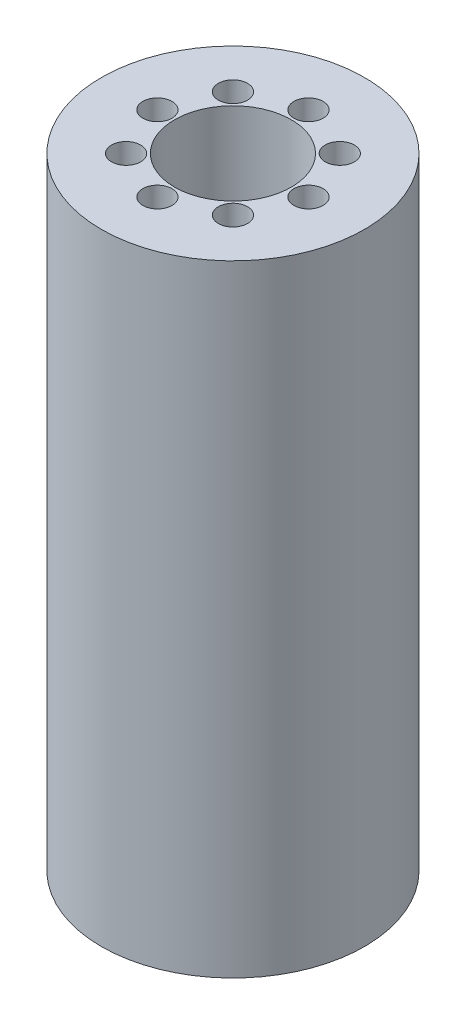
ISO-10303-21;
HEADER;
FILE_DESCRIPTION(('STEP AP214'),'2;1');
FILE_NAME('part.step','',(''),(''),'','','');
FILE_SCHEMA(('AUTOMOTIVE_DESIGN { 1 0 10303 214 1 1 1 1 }'));
ENDSEC;
DATA;
#1=APPLICATION_CONTEXT('core data for automotive mechanical design processes');
#2=APPLICATION_PROTOCOL_DEFINITION('international standard','automotive_design',2000,#1);
#3=PRODUCT_CONTEXT('',#1,'mechanical');
#4=PRODUCT('Part','Part','',(#3));
#5=PRODUCT_RELATED_PRODUCT_CATEGORY('part','',(#4));
#6=PRODUCT_DEFINITION_FORMATION('','',#4);
#7=PRODUCT_DEFINITION_CONTEXT('part definition',#1,'design');
#8=PRODUCT_DEFINITION('design','',#6,#7);
#9=PRODUCT_DEFINITION_SHAPE('','',#8);
#10=(LENGTH_UNIT() NAMED_UNIT(*) SI_UNIT(.MILLI.,.METRE.));
#11=(NAMED_UNIT(*) PLANE_ANGLE_UNIT() SI_UNIT($,.RADIAN.));
#12=(NAMED_UNIT(*) SI_UNIT($,.STERADIAN.) SOLID_ANGLE_UNIT());
#13=UNCERTAINTY_MEASURE_WITH_UNIT(LENGTH_MEASURE(1.E-05),#10,'distance_accuracy_value','');
#14=(GEOMETRIC_REPRESENTATION_CONTEXT(3) GLOBAL_UNCERTAINTY_ASSIGNED_CONTEXT((#13)) GLOBAL_UNIT_ASSIGNED_CONTEXT((#10,
#11,#12)) REPRESENTATION_CONTEXT('',''));
#15=CARTESIAN_POINT('',(0.,0.,0.));
#16=DIRECTION('',(0.,0.,1.));
#17=DIRECTION('',(1.,0.,0.));
#18=AXIS2_PLACEMENT_3D('',#15,#16,#17);
#19=CARTESIAN_POINT('',(0.,319.,0.));
#20=DIRECTION('',(0.,1.,0.));
#21=DIRECTION('',(0.,0.,1.));
#22=AXIS2_PLACEMENT_3D('',#19,#20,#21);
#23=PLANE('',#22);
#24=CARTESIAN_POINT('',(-27.4357431100384,319.,27.4357431100377));
#25=DIRECTION('',(0.,1.,0.));
#26=DIRECTION('',(0.,0.,1.));
#27=AXIS2_PLACEMENT_3D('',#24,#25,#26);
#28=CIRCLE('',#27,7.5);
#29=CARTESIAN_POINT('',(-27.4357431100384,319.,34.9357431100377));
#30=VERTEX_POINT('',#29);
#31=EDGE_CURVE('E65',#30,#30,#28,.T.);
#32=ORIENTED_EDGE('',*,*,#31,.F.);
#33=EDGE_LOOP('',(#32));
#34=FACE_BOUND('',#33,.T.);
#35=CARTESIAN_POINT('',(-4.00721122950642E-13,319.,38.8));
#36=DIRECTION('',(0.,1.,0.));
#37=DIRECTION('',(0.,0.,1.));
#38=AXIS2_PLACEMENT_3D('',#35,#36,#37);
#39=CIRCLE('',#38,7.5);
#40=CARTESIAN_POINT('',(-4.00721122950642E-13,319.,46.3));
#41=VERTEX_POINT('',#40);
#42=EDGE_CURVE('E64',#41,#41,#39,.T.);
#43=ORIENTED_EDGE('',*,*,#42,.F.);
#44=EDGE_LOOP('',(#43));
#45=FACE_BOUND('',#44,.T.);
#46=CARTESIAN_POINT('',(27.4357431100378,319.,27.4357431100383));
#47=DIRECTION('',(0.,1.,0.));
#48=DIRECTION('',(0.,0.,1.));
#49=AXIS2_PLACEMENT_3D('',#46,#47,#48);
#50=CIRCLE('',#49,7.5);
#51=CARTESIAN_POINT('',(27.4357431100378,319.,34.9357431100383));
#52=VERTEX_POINT('',#51);
#53=EDGE_CURVE('E71',#52,#52,#50,.T.);
#54=ORIENTED_EDGE('',*,*,#53,.F.);
#55=EDGE_LOOP('',(#54));
#56=FACE_BOUND('',#55,.T.);
#57=CARTESIAN_POINT('',(38.8,319.,2.63677968348475E-13));
#58=DIRECTION('',(0.,1.,0.));
#59=DIRECTION('',(0.,0.,1.));
#60=AXIS2_PLACEMENT_3D('',#57,#58,#59);
#61=CIRCLE('',#60,7.5);
#62=CARTESIAN_POINT('',(38.8,319.,7.50000000000026));
#63=VERTEX_POINT('',#62);
#64=EDGE_CURVE('E83',#63,#63,#61,.T.);
#65=ORIENTED_EDGE('',*,*,#64,.F.);
#66=EDGE_LOOP('',(#65));
#67=FACE_BOUND('',#66,.T.);
#68=CARTESIAN_POINT('',(-27.4357431100376,319.,-27.4357431100385));
#69=DIRECTION('',(0.,1.,0.));
#70=DIRECTION('',(0.,0.,1.));
#71=AXIS2_PLACEMENT_3D('',#68,#69,#70);
#72=CIRCLE('',#71,7.5);
#73=CARTESIAN_POINT('',(-27.4357431100376,319.,-19.9357431100385));
#74=VERTEX_POINT('',#73);
#75=EDGE_CURVE('E84',#74,#74,#72,.T.);
#76=ORIENTED_EDGE('',*,*,#75,.F.);
#77=EDGE_LOOP('',(#76));
#78=FACE_BOUND('',#77,.T.);
#79=CARTESIAN_POINT('',(1.38777878078145E-13,319.,-38.8));
#80=DIRECTION('',(0.,1.,0.));
#81=DIRECTION('',(0.,0.,1.));
#82=AXIS2_PLACEMENT_3D('',#79,#80,#81);
#83=CIRCLE('',#82,7.5);
#84=CARTESIAN_POINT('',(1.38777878078145E-13,319.,-31.3));
#85=VERTEX_POINT('',#84);
#86=EDGE_CURVE('E95',#85,#85,#83,.T.);
#87=ORIENTED_EDGE('',*,*,#86,.F.);
#88=EDGE_LOOP('',(#87));
#89=FACE_BOUND('',#88,.T.);
#90=CARTESIAN_POINT('',(27.4357431100382,319.,-27.4357431100379));
#91=DIRECTION('',(0.,1.,0.));
#92=DIRECTION('',(0.,0.,1.));
#93=AXIS2_PLACEMENT_3D('',#90,#91,#92);
#94=CIRCLE('',#93,7.5);
#95=CARTESIAN_POINT('',(27.4357431100382,319.,-19.9357431100379));
#96=VERTEX_POINT('',#95);
#97=EDGE_CURVE('E77',#96,#96,#94,.T.);
#98=ORIENTED_EDGE('',*,*,#97,.F.);
#99=EDGE_LOOP('',(#98));
#100=FACE_BOUND('',#99,.T.);
#101=CARTESIAN_POINT('',(-38.8,319.,0.));
#102=DIRECTION('',(0.,1.,0.));
#103=DIRECTION('',(0.,0.,1.));
#104=AXIS2_PLACEMENT_3D('',#101,#102,#103);
#105=CIRCLE('',#104,7.5);
#106=CARTESIAN_POINT('',(-38.8,319.,7.5));
#107=VERTEX_POINT('',#106);
#108=EDGE_CURVE('E57',#107,#107,#105,.T.);
#109=ORIENTED_EDGE('',*,*,#108,.F.);
#110=EDGE_LOOP('',(#109));
#111=FACE_BOUND('',#110,.T.);
#112=CARTESIAN_POINT('',(0.,319.,0.));
#113=DIRECTION('',(0.,1.,0.));
#114=DIRECTION('',(0.,0.,1.));
#115=AXIS2_PLACEMENT_3D('',#112,#113,#114);
#116=CIRCLE('',#115,67.58);
#117=CARTESIAN_POINT('',(0.,319.,67.58));
#118=VERTEX_POINT('',#117);
#119=EDGE_CURVE('E10',#118,#118,#116,.T.);
#120=ORIENTED_EDGE('',*,*,#119,.T.);
#121=EDGE_LOOP('',(#120));
#122=FACE_BOUND('',#121,.T.);
#123=CARTESIAN_POINT('',(0.,319.,0.));
#124=DIRECTION('',(0.,1.,0.));
#125=DIRECTION('',(0.,0.,1.));
#126=AXIS2_PLACEMENT_3D('',#123,#124,#125);
#127=CIRCLE('',#126,30.);
#128=CARTESIAN_POINT('',(0.,319.,30.));
#129=VERTEX_POINT('',#128);
#130=EDGE_CURVE('E47',#129,#129,#127,.T.);
#131=ORIENTED_EDGE('',*,*,#130,.F.);
#132=EDGE_LOOP('',(#131));
#133=FACE_BOUND('',#132,.T.);
#134=ADVANCED_FACE('F36',(#34,#45,#56,#67,#78,#89,#100,#111,#122,#133),#23,.T.);
#135=CARTESIAN_POINT('',(0.,0.,0.));
#136=DIRECTION('',(0.,1.,0.));
#137=DIRECTION('',(0.,0.,1.));
#138=AXIS2_PLACEMENT_3D('',#135,#136,#137);
#139=PLANE('',#138);
#140=CARTESIAN_POINT('',(-27.4357431100384,0.,27.4357431100377));
#141=DIRECTION('',(0.,1.,0.));
#142=DIRECTION('',(0.,0.,1.));
#143=AXIS2_PLACEMENT_3D('',#140,#141,#142);
#144=CIRCLE('',#143,7.5);
#145=CARTESIAN_POINT('',(-27.4357431100384,0.,34.9357431100377));
#146=VERTEX_POINT('',#145);
#147=EDGE_CURVE('E61',#146,#146,#144,.F.);
#148=ORIENTED_EDGE('',*,*,#147,.F.);
#149=EDGE_LOOP('',(#148));
#150=FACE_BOUND('',#149,.T.);
#151=CARTESIAN_POINT('',(-4.00721122950642E-13,0.,38.8));
#152=DIRECTION('',(0.,1.,0.));
#153=DIRECTION('',(0.,0.,1.));
#154=AXIS2_PLACEMENT_3D('',#151,#152,#153);
#155=CIRCLE('',#154,7.5);
#156=CARTESIAN_POINT('',(-4.00721122950642E-13,0.,46.3));
#157=VERTEX_POINT('',#156);
#158=EDGE_CURVE('E68',#157,#157,#155,.F.);
#159=ORIENTED_EDGE('',*,*,#158,.F.);
#160=EDGE_LOOP('',(#159));
#161=FACE_BOUND('',#160,.T.);
#162=CARTESIAN_POINT('',(27.4357431100378,0.,27.4357431100383));
#163=DIRECTION('',(0.,1.,0.));
#164=DIRECTION('',(0.,0.,1.));
#165=AXIS2_PLACEMENT_3D('',#162,#163,#164);
#166=CIRCLE('',#165,7.5);
#167=CARTESIAN_POINT('',(27.4357431100378,0.,34.9357431100383));
#168=VERTEX_POINT('',#167);
#169=EDGE_CURVE('E74',#168,#168,#166,.F.);
#170=ORIENTED_EDGE('',*,*,#169,.F.);
#171=EDGE_LOOP('',(#170));
#172=FACE_BOUND('',#171,.T.);
#173=CARTESIAN_POINT('',(38.8,0.,2.63677968348475E-13));
#174=DIRECTION('',(0.,1.,0.));
#175=DIRECTION('',(0.,0.,1.));
#176=AXIS2_PLACEMENT_3D('',#173,#174,#175);
#177=CIRCLE('',#176,7.5);
#178=CARTESIAN_POINT('',(38.8,0.,7.50000000000026));
#179=VERTEX_POINT('',#178);
#180=EDGE_CURVE('E60',#179,#179,#177,.F.);
#181=ORIENTED_EDGE('',*,*,#180,.F.);
#182=EDGE_LOOP('',(#181));
#183=FACE_BOUND('',#182,.T.);
#184=CARTESIAN_POINT('',(-27.4357431100376,0.,-27.4357431100385));
#185=DIRECTION('',(0.,1.,0.));
#186=DIRECTION('',(0.,0.,1.));
#187=AXIS2_PLACEMENT_3D('',#184,#185,#186);
#188=CIRCLE('',#187,7.5);
#189=CARTESIAN_POINT('',(-27.4357431100376,0.,-19.9357431100385));
#190=VERTEX_POINT('',#189);
#191=EDGE_CURVE('E80',#190,#190,#188,.F.);
#192=ORIENTED_EDGE('',*,*,#191,.F.);
#193=EDGE_LOOP('',(#192));
#194=FACE_BOUND('',#193,.T.);
#195=CARTESIAN_POINT('',(1.38777878078145E-13,0.,-38.8));
#196=DIRECTION('',(0.,1.,0.));
#197=DIRECTION('',(0.,0.,1.));
#198=AXIS2_PLACEMENT_3D('',#195,#196,#197);
#199=CIRCLE('',#198,7.5);
#200=CARTESIAN_POINT('',(1.38777878078145E-13,0.,-31.3));
#201=VERTEX_POINT('',#200);
#202=EDGE_CURVE('E87',#201,#201,#199,.F.);
#203=ORIENTED_EDGE('',*,*,#202,.F.);
#204=EDGE_LOOP('',(#203));
#205=FACE_BOUND('',#204,.T.);
#206=CARTESIAN_POINT('',(27.4357431100382,0.,-27.4357431100379));
#207=DIRECTION('',(0.,1.,0.));
#208=DIRECTION('',(0.,0.,1.));
#209=AXIS2_PLACEMENT_3D('',#206,#207,#208);
#210=CIRCLE('',#209,7.5);
#211=CARTESIAN_POINT('',(27.4357431100382,0.,-19.9357431100379));
#212=VERTEX_POINT('',#211);
#213=EDGE_CURVE('E92',#212,#212,#210,.F.);
#214=ORIENTED_EDGE('',*,*,#213,.F.);
#215=EDGE_LOOP('',(#214));
#216=FACE_BOUND('',#215,.T.);
#217=CARTESIAN_POINT('',(-38.8,0.,0.));
#218=DIRECTION('',(0.,1.,0.));
#219=DIRECTION('',(0.,0.,1.));
#220=AXIS2_PLACEMENT_3D('',#217,#218,#219);
#221=CIRCLE('',#220,7.5);
#222=CARTESIAN_POINT('',(-38.8,0.,7.5));
#223=VERTEX_POINT('',#222);
#224=EDGE_CURVE('E52',#223,#223,#221,.F.);
#225=ORIENTED_EDGE('',*,*,#224,.F.);
#226=EDGE_LOOP('',(#225));
#227=FACE_BOUND('',#226,.T.);
#228=CARTESIAN_POINT('',(0.,0.,0.));
#229=DIRECTION('',(0.,1.,0.));
#230=DIRECTION('',(0.,0.,1.));
#231=AXIS2_PLACEMENT_3D('',#228,#229,#230);
#232=CIRCLE('',#231,67.58);
#233=CARTESIAN_POINT('',(0.,0.,67.58));
#234=VERTEX_POINT('',#233);
#235=EDGE_CURVE('E40',#234,#234,#232,.T.);
#236=ORIENTED_EDGE('',*,*,#235,.F.);
#237=EDGE_LOOP('',(#236));
#238=FACE_BOUND('',#237,.T.);
#239=CARTESIAN_POINT('',(0.,0.,0.));
#240=DIRECTION('',(0.,1.,0.));
#241=DIRECTION('',(0.,0.,1.));
#242=AXIS2_PLACEMENT_3D('',#239,#240,#241);
#243=CIRCLE('',#242,30.);
#244=CARTESIAN_POINT('',(0.,0.,30.));
#245=VERTEX_POINT('',#244);
#246=EDGE_CURVE('E49',#245,#245,#243,.T.);
#247=ORIENTED_EDGE('',*,*,#246,.T.);
#248=EDGE_LOOP('',(#247));
#249=FACE_BOUND('',#248,.T.);
#250=ADVANCED_FACE('F108',(#150,#161,#172,#183,#194,#205,#216,#227,#238,#249),#139,.F.);
#251=CARTESIAN_POINT('',(0.,319.,0.));
#252=DIRECTION('',(0.,-1.,0.));
#253=DIRECTION('',(0.,0.,-1.));
#254=AXIS2_PLACEMENT_3D('',#251,#252,#253);
#255=CYLINDRICAL_SURFACE('',#254,67.58);
#256=ORIENTED_EDGE('',*,*,#119,.F.);
#257=EDGE_LOOP('',(#256));
#258=FACE_BOUND('',#257,.T.);
#259=ORIENTED_EDGE('',*,*,#235,.T.);
#260=EDGE_LOOP('',(#259));
#261=FACE_BOUND('',#260,.T.);
#262=ADVANCED_FACE('F38',(#258,#261),#255,.T.);
#263=CARTESIAN_POINT('',(0.,319.,0.));
#264=DIRECTION('',(0.,-1.,0.));
#265=DIRECTION('',(0.,0.,-1.));
#266=AXIS2_PLACEMENT_3D('',#263,#264,#265);
#267=CYLINDRICAL_SURFACE('',#266,30.);
#268=ORIENTED_EDGE('',*,*,#130,.T.);
#269=EDGE_LOOP('',(#268));
#270=FACE_BOUND('',#269,.T.);
#271=ORIENTED_EDGE('',*,*,#246,.F.);
#272=EDGE_LOOP('',(#271));
#273=FACE_BOUND('',#272,.T.);
#274=ADVANCED_FACE('F117',(#270,#273),#267,.F.);
#275=CARTESIAN_POINT('',(-38.8,-0.000999999999973245,0.));
#276=DIRECTION('',(0.,1.,0.));
#277=DIRECTION('',(0.,0.,1.));
#278=AXIS2_PLACEMENT_3D('',#275,#276,#277);
#279=CYLINDRICAL_SURFACE('',#278,7.5);
#280=ORIENTED_EDGE('',*,*,#108,.T.);
#281=EDGE_LOOP('',(#280));
#282=FACE_BOUND('',#281,.T.);
#283=ORIENTED_EDGE('',*,*,#224,.T.);
#284=EDGE_LOOP('',(#283));
#285=FACE_BOUND('',#284,.T.);
#286=ADVANCED_FACE('F120',(#282,#285),#279,.F.);
#287=CARTESIAN_POINT('',(27.4357431100382,-0.000999999999973245,-27.4357431100379));
#288=DIRECTION('',(0.,1.,0.));
#289=DIRECTION('',(0.,0.,1.));
#290=AXIS2_PLACEMENT_3D('',#287,#288,#289);
#291=CYLINDRICAL_SURFACE('',#290,7.5);
#292=ORIENTED_EDGE('',*,*,#97,.T.);
#293=EDGE_LOOP('',(#292));
#294=FACE_BOUND('',#293,.T.);
#295=ORIENTED_EDGE('',*,*,#213,.T.);
#296=EDGE_LOOP('',(#295));
#297=FACE_BOUND('',#296,.T.);
#298=ADVANCED_FACE('F135',(#294,#297),#291,.F.);
#299=CARTESIAN_POINT('',(1.38777878078145E-13,-0.000999999999973245,-38.8));
#300=DIRECTION('',(0.,1.,0.));
#301=DIRECTION('',(0.,0.,1.));
#302=AXIS2_PLACEMENT_3D('',#299,#300,#301);
#303=CYLINDRICAL_SURFACE('',#302,7.5);
#304=ORIENTED_EDGE('',*,*,#86,.T.);
#305=EDGE_LOOP('',(#304));
#306=FACE_BOUND('',#305,.T.);
#307=ORIENTED_EDGE('',*,*,#202,.T.);
#308=EDGE_LOOP('',(#307));
#309=FACE_BOUND('',#308,.T.);
#310=ADVANCED_FACE('F103',(#306,#309),#303,.F.);
#311=CARTESIAN_POINT('',(-27.4357431100376,-0.000999999999973245,-27.4357431100385));
#312=DIRECTION('',(0.,1.,0.));
#313=DIRECTION('',(0.,0.,1.));
#314=AXIS2_PLACEMENT_3D('',#311,#312,#313);
#315=CYLINDRICAL_SURFACE('',#314,7.5);
#316=ORIENTED_EDGE('',*,*,#75,.T.);
#317=EDGE_LOOP('',(#316));
#318=FACE_BOUND('',#317,.T.);
#319=ORIENTED_EDGE('',*,*,#191,.T.);
#320=EDGE_LOOP('',(#319));
#321=FACE_BOUND('',#320,.T.);
#322=ADVANCED_FACE('F150',(#318,#321),#315,.F.);
#323=CARTESIAN_POINT('',(38.8,-0.000999999999973245,2.63677968348475E-13));
#324=DIRECTION('',(0.,1.,0.));
#325=DIRECTION('',(0.,0.,1.));
#326=AXIS2_PLACEMENT_3D('',#323,#324,#325);
#327=CYLINDRICAL_SURFACE('',#326,7.5);
#328=ORIENTED_EDGE('',*,*,#64,.T.);
#329=EDGE_LOOP('',(#328));
#330=FACE_BOUND('',#329,.T.);
#331=ORIENTED_EDGE('',*,*,#180,.T.);
#332=EDGE_LOOP('',(#331));
#333=FACE_BOUND('',#332,.T.);
#334=ADVANCED_FACE('F148',(#330,#333),#327,.F.);
#335=CARTESIAN_POINT('',(27.4357431100378,-0.000999999999973245,27.4357431100383));
#336=DIRECTION('',(0.,1.,0.));
#337=DIRECTION('',(0.,0.,1.));
#338=AXIS2_PLACEMENT_3D('',#335,#336,#337);
#339=CYLINDRICAL_SURFACE('',#338,7.5);
#340=ORIENTED_EDGE('',*,*,#53,.T.);
#341=EDGE_LOOP('',(#340));
#342=FACE_BOUND('',#341,.T.);
#343=ORIENTED_EDGE('',*,*,#169,.T.);
#344=EDGE_LOOP('',(#343));
#345=FACE_BOUND('',#344,.T.);
#346=ADVANCED_FACE('F144',(#342,#345),#339,.F.);
#347=CARTESIAN_POINT('',(-4.00721122950642E-13,-0.000999999999973245,38.8));
#348=DIRECTION('',(0.,1.,0.));
#349=DIRECTION('',(0.,0.,1.));
#350=AXIS2_PLACEMENT_3D('',#347,#348,#349);
#351=CYLINDRICAL_SURFACE('',#350,7.5);
#352=ORIENTED_EDGE('',*,*,#42,.T.);
#353=EDGE_LOOP('',(#352));
#354=FACE_BOUND('',#353,.T.);
#355=ORIENTED_EDGE('',*,*,#158,.T.);
#356=EDGE_LOOP('',(#355));
#357=FACE_BOUND('',#356,.T.);
#358=ADVANCED_FACE('F140',(#354,#357),#351,.F.);
#359=CARTESIAN_POINT('',(-27.4357431100384,-0.000999999999973245,27.4357431100377));
#360=DIRECTION('',(0.,1.,0.));
#361=DIRECTION('',(0.,0.,1.));
#362=AXIS2_PLACEMENT_3D('',#359,#360,#361);
#363=CYLINDRICAL_SURFACE('',#362,7.5);
#364=ORIENTED_EDGE('',*,*,#31,.T.);
#365=EDGE_LOOP('',(#364));
#366=FACE_BOUND('',#365,.T.);
#367=ORIENTED_EDGE('',*,*,#147,.T.);
#368=EDGE_LOOP('',(#367));
#369=FACE_BOUND('',#368,.T.);
#370=ADVANCED_FACE('F137',(#366,#369),#363,.F.);
#371=CLOSED_SHELL('',(#134,#250,#262,#274,#286,#298,#310,#322,#334,#346,#358,#370));
#372=MANIFOLD_SOLID_BREP('B2',#371);
#373=ADVANCED_BREP_SHAPE_REPRESENTATION('',(#18,#372),#14);
#374=SHAPE_DEFINITION_REPRESENTATION(#9,#373);
ENDSEC;
END-ISO-10303-21;
